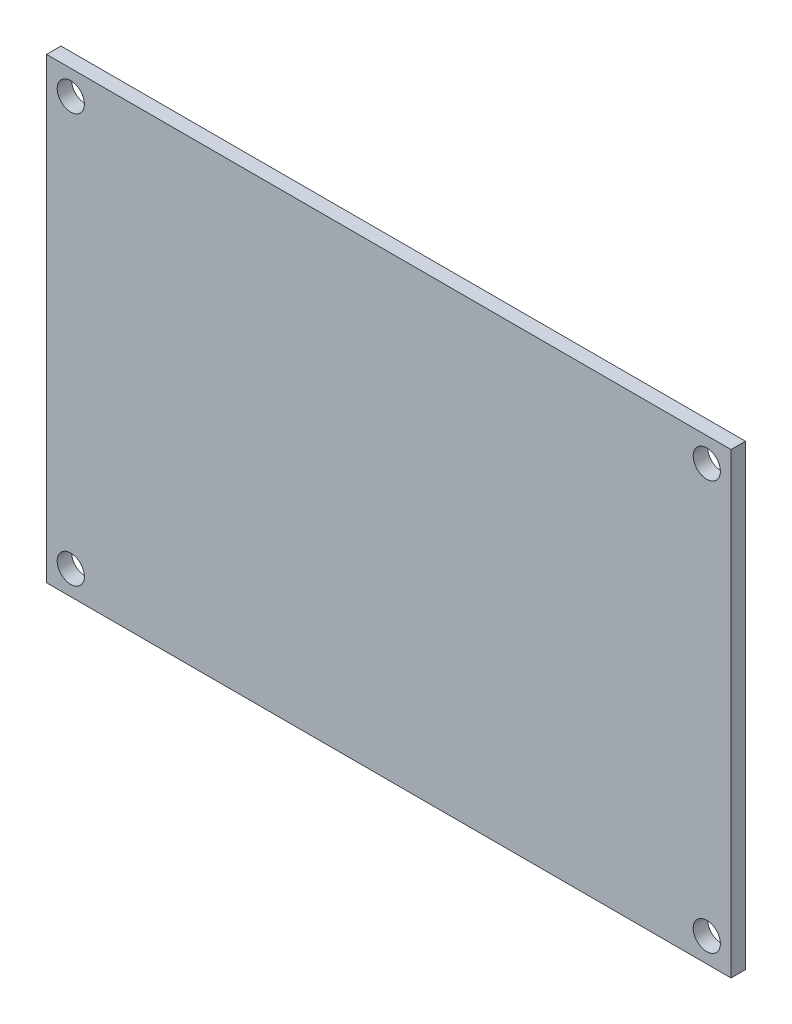
ISO-10303-21;
HEADER;
FILE_DESCRIPTION(('STEP AP214'),'2;1');
FILE_NAME('part.step','',(''),(''),'','','');
FILE_SCHEMA(('AUTOMOTIVE_DESIGN { 1 0 10303 214 1 1 1 1 }'));
ENDSEC;
DATA;
#1=APPLICATION_CONTEXT('core data for automotive mechanical design processes');
#2=APPLICATION_PROTOCOL_DEFINITION('international standard','automotive_design',2000,#1);
#3=PRODUCT_CONTEXT('',#1,'mechanical');
#4=PRODUCT('Part','Part','',(#3));
#5=PRODUCT_RELATED_PRODUCT_CATEGORY('part','',(#4));
#6=PRODUCT_DEFINITION_FORMATION('','',#4);
#7=PRODUCT_DEFINITION_CONTEXT('part definition',#1,'design');
#8=PRODUCT_DEFINITION('design','',#6,#7);
#9=PRODUCT_DEFINITION_SHAPE('','',#8);
#10=(LENGTH_UNIT() NAMED_UNIT(*) SI_UNIT(.MILLI.,.METRE.));
#11=(NAMED_UNIT(*) PLANE_ANGLE_UNIT() SI_UNIT($,.RADIAN.));
#12=(NAMED_UNIT(*) SI_UNIT($,.STERADIAN.) SOLID_ANGLE_UNIT());
#13=UNCERTAINTY_MEASURE_WITH_UNIT(LENGTH_MEASURE(1.E-05),#10,'distance_accuracy_value','');
#14=(GEOMETRIC_REPRESENTATION_CONTEXT(3) GLOBAL_UNCERTAINTY_ASSIGNED_CONTEXT((#13)) GLOBAL_UNIT_ASSIGNED_CONTEXT((#10,
#11,#12)) REPRESENTATION_CONTEXT('',''));
#15=CARTESIAN_POINT('',(0.,0.,0.));
#16=DIRECTION('',(0.,0.,1.));
#17=DIRECTION('',(1.,0.,0.));
#18=AXIS2_PLACEMENT_3D('',#15,#16,#17);
#19=CARTESIAN_POINT('',(0.,0.,1.27));
#20=DIRECTION('',(0.,0.,-1.));
#21=DIRECTION('',(-1.,0.,0.));
#22=AXIS2_PLACEMENT_3D('',#19,#20,#21);
#23=PLANE('',#22);
#24=DIRECTION('',(0.,-1.,0.));
#25=VECTOR('',#24,1.);
#26=CARTESIAN_POINT('',(0.,0.,1.27));
#27=LINE('',#26,#25);
#28=CARTESIAN_POINT('',(0.,40.2082,1.27));
#29=VERTEX_POINT('',#28);
#30=CARTESIAN_POINT('',(0.,0.,1.27));
#31=VERTEX_POINT('',#30);
#32=EDGE_CURVE('E87',#29,#31,#27,.T.);
#33=ORIENTED_EDGE('',*,*,#32,.T.);
#34=DIRECTION('',(1.,0.,0.));
#35=VECTOR('',#34,1.);
#36=CARTESIAN_POINT('',(0.,0.,1.27));
#37=LINE('',#36,#35);
#38=CARTESIAN_POINT('',(60.1472,0.,1.27));
#39=VERTEX_POINT('',#38);
#40=EDGE_CURVE('E82',#31,#39,#37,.T.);
#41=ORIENTED_EDGE('',*,*,#40,.T.);
#42=DIRECTION('',(0.,1.,0.));
#43=VECTOR('',#42,1.);
#44=CARTESIAN_POINT('',(60.1472,0.,1.27));
#45=LINE('',#44,#43);
#46=CARTESIAN_POINT('',(60.1472,40.2082,1.27));
#47=VERTEX_POINT('',#46);
#48=EDGE_CURVE('E85',#39,#47,#45,.T.);
#49=ORIENTED_EDGE('',*,*,#48,.T.);
#50=DIRECTION('',(-1.,0.,0.));
#51=VECTOR('',#50,1.);
#52=CARTESIAN_POINT('',(0.,40.2082,1.27));
#53=LINE('',#52,#51);
#54=EDGE_CURVE('E52',#47,#29,#53,.T.);
#55=ORIENTED_EDGE('',*,*,#54,.T.);
#56=EDGE_LOOP('',(#33,#41,#49,#55));
#57=FACE_BOUND('',#56,.T.);
#58=CARTESIAN_POINT('',(2.1336,38.0746,1.27));
#59=DIRECTION('',(0.,0.,1.));
#60=DIRECTION('',(1.,0.,0.));
#61=AXIS2_PLACEMENT_3D('',#58,#59,#60);
#62=CIRCLE('',#61,1.1938);
#63=CARTESIAN_POINT('',(3.3274,38.0746,1.27));
#64=VERTEX_POINT('',#63);
#65=EDGE_CURVE('E102',#64,#64,#62,.T.);
#66=ORIENTED_EDGE('',*,*,#65,.F.);
#67=EDGE_LOOP('',(#66));
#68=FACE_BOUND('',#67,.T.);
#69=CARTESIAN_POINT('',(58.0136,38.0746,1.27));
#70=DIRECTION('',(0.,0.,1.));
#71=DIRECTION('',(1.,0.,0.));
#72=AXIS2_PLACEMENT_3D('',#69,#70,#71);
#73=CIRCLE('',#72,1.1938);
#74=CARTESIAN_POINT('',(59.2074,38.0746,1.27));
#75=VERTEX_POINT('',#74);
#76=EDGE_CURVE('E117',#75,#75,#73,.T.);
#77=ORIENTED_EDGE('',*,*,#76,.F.);
#78=EDGE_LOOP('',(#77));
#79=FACE_BOUND('',#78,.T.);
#80=CARTESIAN_POINT('',(2.1336,2.1336,1.27));
#81=DIRECTION('',(0.,0.,1.));
#82=DIRECTION('',(1.,0.,0.));
#83=AXIS2_PLACEMENT_3D('',#80,#81,#82);
#84=CIRCLE('',#83,1.1938);
#85=CARTESIAN_POINT('',(3.3274,2.1336,1.27));
#86=VERTEX_POINT('',#85);
#87=EDGE_CURVE('E123',#86,#86,#84,.T.);
#88=ORIENTED_EDGE('',*,*,#87,.F.);
#89=EDGE_LOOP('',(#88));
#90=FACE_BOUND('',#89,.T.);
#91=CARTESIAN_POINT('',(58.0136,2.1336,1.27));
#92=DIRECTION('',(0.,0.,1.));
#93=DIRECTION('',(1.,0.,0.));
#94=AXIS2_PLACEMENT_3D('',#91,#92,#93);
#95=CIRCLE('',#94,1.1938);
#96=CARTESIAN_POINT('',(59.2074,2.1336,1.27));
#97=VERTEX_POINT('',#96);
#98=EDGE_CURVE('E129',#97,#97,#95,.T.);
#99=ORIENTED_EDGE('',*,*,#98,.F.);
#100=EDGE_LOOP('',(#99));
#101=FACE_BOUND('',#100,.T.);
#102=ADVANCED_FACE('F35',(#57,#68,#79,#90,#101),#23,.F.);
#103=CARTESIAN_POINT('',(0.,0.,0.));
#104=DIRECTION('',(0.,0.,-1.));
#105=DIRECTION('',(-1.,0.,0.));
#106=AXIS2_PLACEMENT_3D('',#103,#104,#105);
#107=PLANE('',#106);
#108=CARTESIAN_POINT('',(2.1336,2.1336,0.));
#109=DIRECTION('',(0.,0.,1.));
#110=DIRECTION('',(1.,0.,0.));
#111=AXIS2_PLACEMENT_3D('',#108,#109,#110);
#112=CIRCLE('',#111,1.1938);
#113=CARTESIAN_POINT('',(3.3274,2.1336,0.));
#114=VERTEX_POINT('',#113);
#115=EDGE_CURVE('E126',#114,#114,#112,.T.);
#116=ORIENTED_EDGE('',*,*,#115,.T.);
#117=EDGE_LOOP('',(#116));
#118=FACE_BOUND('',#117,.T.);
#119=CARTESIAN_POINT('',(2.1336,38.0746,0.));
#120=DIRECTION('',(0.,0.,1.));
#121=DIRECTION('',(1.,0.,0.));
#122=AXIS2_PLACEMENT_3D('',#119,#120,#121);
#123=CIRCLE('',#122,1.1938);
#124=CARTESIAN_POINT('',(3.3274,38.0746,0.));
#125=VERTEX_POINT('',#124);
#126=EDGE_CURVE('E114',#125,#125,#123,.T.);
#127=ORIENTED_EDGE('',*,*,#126,.T.);
#128=EDGE_LOOP('',(#127));
#129=FACE_BOUND('',#128,.T.);
#130=DIRECTION('',(0.,-1.,0.));
#131=VECTOR('',#130,1.);
#132=CARTESIAN_POINT('',(0.,0.,0.));
#133=LINE('',#132,#131);
#134=CARTESIAN_POINT('',(0.,40.2082,0.));
#135=VERTEX_POINT('',#134);
#136=CARTESIAN_POINT('',(0.,0.,0.));
#137=VERTEX_POINT('',#136);
#138=EDGE_CURVE('E99',#135,#137,#133,.T.);
#139=ORIENTED_EDGE('',*,*,#138,.F.);
#140=DIRECTION('',(-1.,0.,0.));
#141=VECTOR('',#140,1.);
#142=CARTESIAN_POINT('',(0.,40.2082,0.));
#143=LINE('',#142,#141);
#144=CARTESIAN_POINT('',(60.1472,40.2082,0.));
#145=VERTEX_POINT('',#144);
#146=EDGE_CURVE('E75',#145,#135,#143,.T.);
#147=ORIENTED_EDGE('',*,*,#146,.F.);
#148=DIRECTION('',(0.,1.,0.));
#149=VECTOR('',#148,1.);
#150=CARTESIAN_POINT('',(60.1472,0.,0.));
#151=LINE('',#150,#149);
#152=CARTESIAN_POINT('',(60.1472,0.,0.));
#153=VERTEX_POINT('',#152);
#154=EDGE_CURVE('E69',#153,#145,#151,.T.);
#155=ORIENTED_EDGE('',*,*,#154,.F.);
#156=DIRECTION('',(1.,0.,0.));
#157=VECTOR('',#156,1.);
#158=CARTESIAN_POINT('',(0.,0.,0.));
#159=LINE('',#158,#157);
#160=EDGE_CURVE('E91',#137,#153,#159,.T.);
#161=ORIENTED_EDGE('',*,*,#160,.F.);
#162=EDGE_LOOP('',(#139,#147,#155,#161));
#163=FACE_BOUND('',#162,.T.);
#164=CARTESIAN_POINT('',(58.0136,38.0746,0.));
#165=DIRECTION('',(0.,0.,1.));
#166=DIRECTION('',(1.,0.,0.));
#167=AXIS2_PLACEMENT_3D('',#164,#165,#166);
#168=CIRCLE('',#167,1.1938);
#169=CARTESIAN_POINT('',(59.2074,38.0746,0.));
#170=VERTEX_POINT('',#169);
#171=EDGE_CURVE('E120',#170,#170,#168,.T.);
#172=ORIENTED_EDGE('',*,*,#171,.T.);
#173=EDGE_LOOP('',(#172));
#174=FACE_BOUND('',#173,.T.);
#175=CARTESIAN_POINT('',(58.0136,2.1336,0.));
#176=DIRECTION('',(0.,0.,1.));
#177=DIRECTION('',(1.,0.,0.));
#178=AXIS2_PLACEMENT_3D('',#175,#176,#177);
#179=CIRCLE('',#178,1.1938);
#180=CARTESIAN_POINT('',(59.2074,2.1336,0.));
#181=VERTEX_POINT('',#180);
#182=EDGE_CURVE('E132',#181,#181,#179,.T.);
#183=ORIENTED_EDGE('',*,*,#182,.T.);
#184=EDGE_LOOP('',(#183));
#185=FACE_BOUND('',#184,.T.);
#186=ADVANCED_FACE('F110',(#118,#129,#163,#174,#185),#107,.T.);
#187=CARTESIAN_POINT('',(0.,0.,1.27));
#188=DIRECTION('',(1.,0.,0.));
#189=DIRECTION('',(0.,0.,-1.));
#190=AXIS2_PLACEMENT_3D('',#187,#188,#189);
#191=PLANE('',#190);
#192=ORIENTED_EDGE('',*,*,#138,.T.);
#193=DIRECTION('',(0.,0.,-1.));
#194=VECTOR('',#193,1.);
#195=CARTESIAN_POINT('',(0.,0.,1.27));
#196=LINE('',#195,#194);
#197=EDGE_CURVE('E11',#31,#137,#196,.T.);
#198=ORIENTED_EDGE('',*,*,#197,.F.);
#199=ORIENTED_EDGE('',*,*,#32,.F.);
#200=DIRECTION('',(0.,0.,-1.));
#201=VECTOR('',#200,1.);
#202=CARTESIAN_POINT('',(0.,40.2082,1.27));
#203=LINE('',#202,#201);
#204=EDGE_CURVE('E95',#29,#135,#203,.T.);
#205=ORIENTED_EDGE('',*,*,#204,.T.);
#206=EDGE_LOOP('',(#192,#198,#199,#205));
#207=FACE_BOUND('',#206,.T.);
#208=ADVANCED_FACE('F37',(#207),#191,.F.);
#209=CARTESIAN_POINT('',(0.,0.,1.27));
#210=DIRECTION('',(0.,1.,0.));
#211=DIRECTION('',(0.,0.,1.));
#212=AXIS2_PLACEMENT_3D('',#209,#210,#211);
#213=PLANE('',#212);
#214=ORIENTED_EDGE('',*,*,#160,.T.);
#215=DIRECTION('',(0.,0.,-1.));
#216=VECTOR('',#215,1.);
#217=CARTESIAN_POINT('',(60.1472,0.,1.27));
#218=LINE('',#217,#216);
#219=EDGE_CURVE('E44',#39,#153,#218,.T.);
#220=ORIENTED_EDGE('',*,*,#219,.F.);
#221=ORIENTED_EDGE('',*,*,#40,.F.);
#222=ORIENTED_EDGE('',*,*,#197,.T.);
#223=EDGE_LOOP('',(#214,#220,#221,#222));
#224=FACE_BOUND('',#223,.T.);
#225=ADVANCED_FACE('F90',(#224),#213,.F.);
#226=CARTESIAN_POINT('',(60.1472,0.,1.27));
#227=DIRECTION('',(-1.,0.,0.));
#228=DIRECTION('',(0.,0.,1.));
#229=AXIS2_PLACEMENT_3D('',#226,#227,#228);
#230=PLANE('',#229);
#231=ORIENTED_EDGE('',*,*,#154,.T.);
#232=DIRECTION('',(0.,0.,-1.));
#233=VECTOR('',#232,1.);
#234=CARTESIAN_POINT('',(60.1472,40.2082,1.27));
#235=LINE('',#234,#233);
#236=EDGE_CURVE('E92',#47,#145,#235,.T.);
#237=ORIENTED_EDGE('',*,*,#236,.F.);
#238=ORIENTED_EDGE('',*,*,#48,.F.);
#239=ORIENTED_EDGE('',*,*,#219,.T.);
#240=EDGE_LOOP('',(#231,#237,#238,#239));
#241=FACE_BOUND('',#240,.T.);
#242=ADVANCED_FACE('F93',(#241),#230,.F.);
#243=CARTESIAN_POINT('',(0.,40.2082,1.27));
#244=DIRECTION('',(0.,-1.,0.));
#245=DIRECTION('',(0.,0.,-1.));
#246=AXIS2_PLACEMENT_3D('',#243,#244,#245);
#247=PLANE('',#246);
#248=ORIENTED_EDGE('',*,*,#146,.T.);
#249=ORIENTED_EDGE('',*,*,#204,.F.);
#250=ORIENTED_EDGE('',*,*,#54,.F.);
#251=ORIENTED_EDGE('',*,*,#236,.T.);
#252=EDGE_LOOP('',(#248,#249,#250,#251));
#253=FACE_BOUND('',#252,.T.);
#254=ADVANCED_FACE('F107',(#253),#247,.F.);
#255=CARTESIAN_POINT('',(2.1336,38.0746,1.27));
#256=DIRECTION('',(0.,0.,-1.));
#257=DIRECTION('',(-1.,0.,0.));
#258=AXIS2_PLACEMENT_3D('',#255,#256,#257);
#259=CYLINDRICAL_SURFACE('',#258,1.1938);
#260=ORIENTED_EDGE('',*,*,#65,.T.);
#261=EDGE_LOOP('',(#260));
#262=FACE_BOUND('',#261,.T.);
#263=ORIENTED_EDGE('',*,*,#126,.F.);
#264=EDGE_LOOP('',(#263));
#265=FACE_BOUND('',#264,.T.);
#266=ADVANCED_FACE('F149',(#262,#265),#259,.F.);
#267=CARTESIAN_POINT('',(58.0136,38.0746,1.27));
#268=DIRECTION('',(0.,0.,-1.));
#269=DIRECTION('',(-1.,0.,0.));
#270=AXIS2_PLACEMENT_3D('',#267,#268,#269);
#271=CYLINDRICAL_SURFACE('',#270,1.1938);
#272=ORIENTED_EDGE('',*,*,#76,.T.);
#273=EDGE_LOOP('',(#272));
#274=FACE_BOUND('',#273,.T.);
#275=ORIENTED_EDGE('',*,*,#171,.F.);
#276=EDGE_LOOP('',(#275));
#277=FACE_BOUND('',#276,.T.);
#278=ADVANCED_FACE('F195',(#274,#277),#271,.F.);
#279=CARTESIAN_POINT('',(2.1336,2.1336,1.27));
#280=DIRECTION('',(0.,0.,-1.));
#281=DIRECTION('',(-1.,0.,0.));
#282=AXIS2_PLACEMENT_3D('',#279,#280,#281);
#283=CYLINDRICAL_SURFACE('',#282,1.1938);
#284=ORIENTED_EDGE('',*,*,#87,.T.);
#285=EDGE_LOOP('',(#284));
#286=FACE_BOUND('',#285,.T.);
#287=ORIENTED_EDGE('',*,*,#115,.F.);
#288=EDGE_LOOP('',(#287));
#289=FACE_BOUND('',#288,.T.);
#290=ADVANCED_FACE('F203',(#286,#289),#283,.F.);
#291=CARTESIAN_POINT('',(58.0136,2.1336,1.27));
#292=DIRECTION('',(0.,0.,-1.));
#293=DIRECTION('',(-1.,0.,0.));
#294=AXIS2_PLACEMENT_3D('',#291,#292,#293);
#295=CYLINDRICAL_SURFACE('',#294,1.1938);
#296=ORIENTED_EDGE('',*,*,#98,.T.);
#297=EDGE_LOOP('',(#296));
#298=FACE_BOUND('',#297,.T.);
#299=ORIENTED_EDGE('',*,*,#182,.F.);
#300=EDGE_LOOP('',(#299));
#301=FACE_BOUND('',#300,.T.);
#302=ADVANCED_FACE('F138',(#298,#301),#295,.F.);
#303=CLOSED_SHELL('',(#102,#186,#208,#225,#242,#254,#266,#278,#290,#302));
#304=MANIFOLD_SOLID_BREP('B2',#303);
#305=ADVANCED_BREP_SHAPE_REPRESENTATION('',(#18,#304),#14);
#306=SHAPE_DEFINITION_REPRESENTATION(#9,#305);
ENDSEC;
END-ISO-10303-21;
